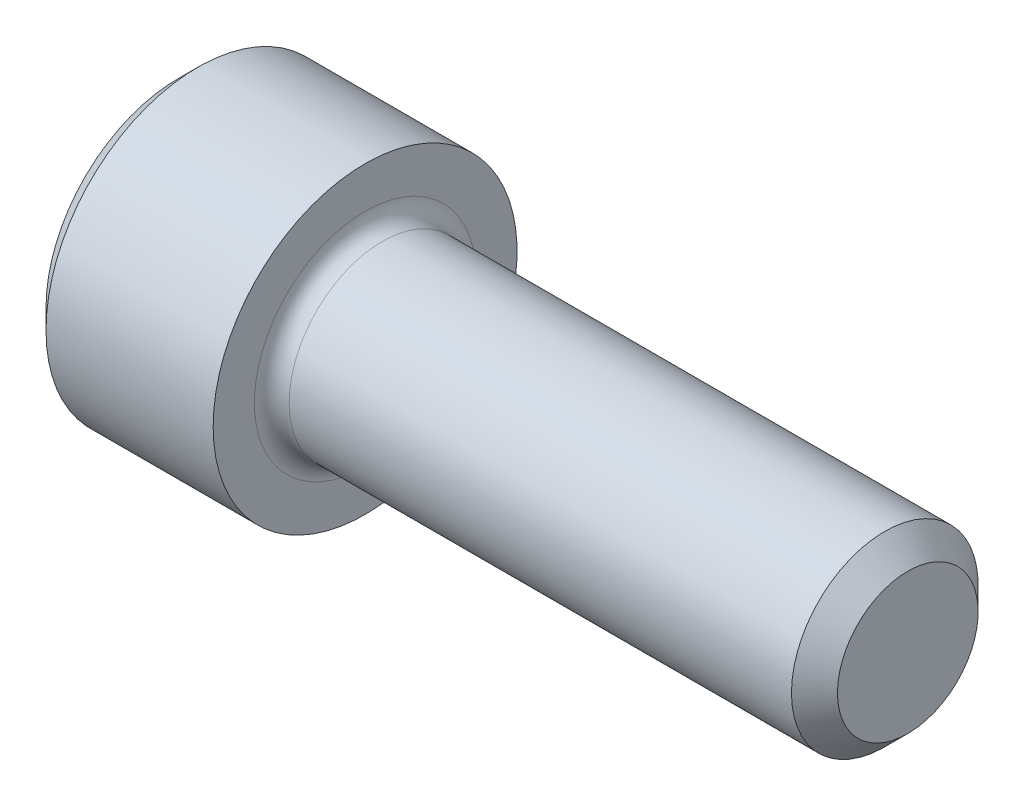
ISO-10303-21;
HEADER;
FILE_DESCRIPTION(('STEP AP214'),'2;1');
FILE_NAME('part.step','',(''),(''),'','','');
FILE_SCHEMA(('AUTOMOTIVE_DESIGN { 1 0 10303 214 1 1 1 1 }'));
ENDSEC;
DATA;
#1=APPLICATION_CONTEXT('core data for automotive mechanical design processes');
#2=APPLICATION_PROTOCOL_DEFINITION('international standard','automotive_design',2000,#1);
#3=PRODUCT_CONTEXT('',#1,'mechanical');
#4=PRODUCT('Part','Part','',(#3));
#5=PRODUCT_RELATED_PRODUCT_CATEGORY('part','',(#4));
#6=PRODUCT_DEFINITION_FORMATION('','',#4);
#7=PRODUCT_DEFINITION_CONTEXT('part definition',#1,'design');
#8=PRODUCT_DEFINITION('design','',#6,#7);
#9=PRODUCT_DEFINITION_SHAPE('','',#8);
#10=(LENGTH_UNIT() NAMED_UNIT(*) SI_UNIT(.MILLI.,.METRE.));
#11=(NAMED_UNIT(*) PLANE_ANGLE_UNIT() SI_UNIT($,.RADIAN.));
#12=(NAMED_UNIT(*) SI_UNIT($,.STERADIAN.) SOLID_ANGLE_UNIT());
#13=UNCERTAINTY_MEASURE_WITH_UNIT(LENGTH_MEASURE(1.E-05),#10,'distance_accuracy_value','');
#14=(GEOMETRIC_REPRESENTATION_CONTEXT(3) GLOBAL_UNCERTAINTY_ASSIGNED_CONTEXT((#13)) GLOBAL_UNIT_ASSIGNED_CONTEXT((#10,
#11,#12)) REPRESENTATION_CONTEXT('',''));
#15=CARTESIAN_POINT('',(0.,0.,0.));
#16=DIRECTION('',(0.,0.,1.));
#17=DIRECTION('',(1.,0.,0.));
#18=AXIS2_PLACEMENT_3D('',#15,#16,#17);
#19=CARTESIAN_POINT('',(0.,0.,0.));
#20=DIRECTION('',(-1.,0.,0.));
#21=DIRECTION('',(0.,0.,1.));
#22=AXIS2_PLACEMENT_3D('',#19,#20,#21);
#23=PLANE('',#22);
#24=DIRECTION('',(0.,-0.499999999999998,0.866025403784439));
#25=VECTOR('',#24,1.);
#26=CARTESIAN_POINT('',(0.,1.14384635331849,0.));
#27=LINE('',#26,#25);
#28=CARTESIAN_POINT('',(0.,1.14384635331849,0.));
#29=VERTEX_POINT('',#28);
#30=CARTESIAN_POINT('',(0.,0.571923176659249,0.990599999999998));
#31=VERTEX_POINT('',#30);
#32=EDGE_CURVE('E260',#29,#31,#27,.T.);
#33=ORIENTED_EDGE('',*,*,#32,.T.);
#34=DIRECTION('',(0.,1.,0.));
#35=VECTOR('',#34,1.);
#36=CARTESIAN_POINT('',(0.,-0.571923176659238,0.9906));
#37=LINE('',#36,#35);
#38=CARTESIAN_POINT('',(0.,-0.571923176659238,0.9906));
#39=VERTEX_POINT('',#38);
#40=EDGE_CURVE('E131',#39,#31,#37,.T.);
#41=ORIENTED_EDGE('',*,*,#40,.F.);
#42=DIRECTION('',(0.,-0.500000000000001,-0.866025403784438));
#43=VECTOR('',#42,1.);
#44=CARTESIAN_POINT('',(0.,-0.571923176659238,0.9906));
#45=LINE('',#44,#43);
#46=CARTESIAN_POINT('',(0.,-1.14384635331848,0.));
#47=VERTEX_POINT('',#46);
#48=EDGE_CURVE('E263',#39,#47,#45,.T.);
#49=ORIENTED_EDGE('',*,*,#48,.T.);
#50=DIRECTION('',(0.,0.499999999999998,-0.86602540378444));
#51=VECTOR('',#50,1.);
#52=CARTESIAN_POINT('',(0.,-1.14384635331848,0.));
#53=LINE('',#52,#51);
#54=CARTESIAN_POINT('',(0.,-0.571923176659241,-0.9906));
#55=VERTEX_POINT('',#54);
#56=EDGE_CURVE('E266',#47,#55,#53,.T.);
#57=ORIENTED_EDGE('',*,*,#56,.T.);
#58=DIRECTION('',(0.,-1.,0.));
#59=VECTOR('',#58,1.);
#60=CARTESIAN_POINT('',(0.,0.571923176659246,-0.990600000000002));
#61=LINE('',#60,#59);
#62=CARTESIAN_POINT('',(0.,0.571923176659246,-0.990600000000002));
#63=VERTEX_POINT('',#62);
#64=EDGE_CURVE('E269',#63,#55,#61,.T.);
#65=ORIENTED_EDGE('',*,*,#64,.F.);
#66=DIRECTION('',(0.,-0.500000000000001,-0.866025403784438));
#67=VECTOR('',#66,1.);
#68=CARTESIAN_POINT('',(0.,1.14384635331849,0.));
#69=LINE('',#68,#67);
#70=EDGE_CURVE('E126',#29,#63,#69,.T.);
#71=ORIENTED_EDGE('',*,*,#70,.F.);
#72=EDGE_LOOP('',(#33,#41,#49,#57,#65,#71));
#73=FACE_BOUND('',#72,.T.);
#74=CARTESIAN_POINT('',(0.,0.,0.));
#75=DIRECTION('',(-1.,0.,0.));
#76=DIRECTION('',(0.,0.,1.));
#77=AXIS2_PLACEMENT_3D('',#74,#75,#76);
#78=CIRCLE('',#77,1.5494);
#79=CARTESIAN_POINT('',(0.,0.,1.5494));
#80=VERTEX_POINT('',#79);
#81=EDGE_CURVE('E155',#80,#80,#78,.T.);
#82=ORIENTED_EDGE('',*,*,#81,.T.);
#83=EDGE_LOOP('',(#82));
#84=FACE_BOUND('',#83,.T.);
#85=ADVANCED_FACE('F35',(#73,#84),#23,.T.);
#86=CARTESIAN_POINT('',(0.,0.,0.));
#87=DIRECTION('',(1.,0.,0.));
#88=DIRECTION('',(0.,0.,-1.));
#89=AXIS2_PLACEMENT_3D('',#86,#87,#88);
#90=CONICAL_SURFACE('',#89,1.5494,0.785398163397442);
#91=CARTESIAN_POINT('',(0.228600000000002,0.,0.));
#92=DIRECTION('',(-1.,0.,0.));
#93=DIRECTION('',(0.,0.,1.));
#94=AXIS2_PLACEMENT_3D('',#91,#92,#93);
#95=CIRCLE('',#94,1.778);
#96=CARTESIAN_POINT('',(0.228600000000002,0.,1.778));
#97=VERTEX_POINT('',#96);
#98=EDGE_CURVE('E152',#97,#97,#95,.T.);
#99=ORIENTED_EDGE('',*,*,#98,.T.);
#100=EDGE_LOOP('',(#99));
#101=FACE_BOUND('',#100,.T.);
#102=ORIENTED_EDGE('',*,*,#81,.F.);
#103=EDGE_LOOP('',(#102));
#104=FACE_BOUND('',#103,.T.);
#105=ADVANCED_FACE('F176',(#101,#104),#90,.T.);
#106=CARTESIAN_POINT('',(-31.75,0.,0.));
#107=DIRECTION('',(-1.,0.,0.));
#108=DIRECTION('',(0.,0.,1.));
#109=AXIS2_PLACEMENT_3D('',#106,#107,#108);
#110=CYLINDRICAL_SURFACE('',#109,1.778);
#111=CARTESIAN_POINT('',(2.1844,0.,0.));
#112=DIRECTION('',(-1.,0.,0.));
#113=DIRECTION('',(0.,0.,1.));
#114=AXIS2_PLACEMENT_3D('',#111,#112,#113);
#115=CIRCLE('',#114,1.778);
#116=CARTESIAN_POINT('',(2.1844,0.,1.778));
#117=VERTEX_POINT('',#116);
#118=EDGE_CURVE('E149',#117,#117,#115,.T.);
#119=ORIENTED_EDGE('',*,*,#118,.T.);
#120=EDGE_LOOP('',(#119));
#121=FACE_BOUND('',#120,.T.);
#122=ORIENTED_EDGE('',*,*,#98,.F.);
#123=EDGE_LOOP('',(#122));
#124=FACE_BOUND('',#123,.T.);
#125=ADVANCED_FACE('F181',(#121,#124),#110,.T.);
#126=CARTESIAN_POINT('',(2.1844,1.778,0.));
#127=DIRECTION('',(1.,0.,0.));
#128=DIRECTION('',(0.,0.,-1.));
#129=AXIS2_PLACEMENT_3D('',#126,#127,#128);
#130=PLANE('',#129);
#131=CARTESIAN_POINT('',(2.1844,0.,0.));
#132=DIRECTION('',(1.,0.,0.));
#133=DIRECTION('',(0.,0.,-1.));
#134=AXIS2_PLACEMENT_3D('',#131,#132,#133);
#135=CIRCLE('',#134,1.29539999999999);
#136=CARTESIAN_POINT('',(2.1844,0.,-1.29539999999999));
#137=VERTEX_POINT('',#136);
#138=EDGE_CURVE('E43',#137,#137,#135,.F.);
#139=ORIENTED_EDGE('',*,*,#138,.T.);
#140=EDGE_LOOP('',(#139));
#141=FACE_BOUND('',#140,.T.);
#142=ORIENTED_EDGE('',*,*,#118,.F.);
#143=EDGE_LOOP('',(#142));
#144=FACE_BOUND('',#143,.T.);
#145=ADVANCED_FACE('F160',(#141,#144),#130,.T.);
#146=CARTESIAN_POINT('',(-31.75,0.,0.));
#147=DIRECTION('',(-1.,0.,0.));
#148=DIRECTION('',(0.,0.,1.));
#149=AXIS2_PLACEMENT_3D('',#146,#147,#148);
#150=CYLINDRICAL_SURFACE('',#149,1.09219999999999);
#151=CARTESIAN_POINT('',(2.3876,0.,0.));
#152=DIRECTION('',(1.,0.,0.));
#153=DIRECTION('',(0.,0.,-1.));
#154=AXIS2_PLACEMENT_3D('',#151,#152,#153);
#155=CIRCLE('',#154,1.09219999999999);
#156=CARTESIAN_POINT('',(2.3876,0.,-1.09219999999999));
#157=VERTEX_POINT('',#156);
#158=EDGE_CURVE('E11',#157,#157,#155,.T.);
#159=ORIENTED_EDGE('',*,*,#158,.T.);
#160=EDGE_LOOP('',(#159));
#161=FACE_BOUND('',#160,.T.);
#162=CARTESIAN_POINT('',(8.26515999999999,0.,0.));
#163=DIRECTION('',(-1.,0.,0.));
#164=DIRECTION('',(0.,0.,1.));
#165=AXIS2_PLACEMENT_3D('',#162,#163,#164);
#166=CIRCLE('',#165,1.09219999999998);
#167=CARTESIAN_POINT('',(8.26515999999999,0.,1.09219999999998));
#168=VERTEX_POINT('',#167);
#169=EDGE_CURVE('E146',#168,#168,#166,.T.);
#170=ORIENTED_EDGE('',*,*,#169,.T.);
#171=EDGE_LOOP('',(#170));
#172=FACE_BOUND('',#171,.T.);
#173=ADVANCED_FACE('F191',(#161,#172),#150,.T.);
#174=CARTESIAN_POINT('',(8.5344,0.,0.));
#175=DIRECTION('',(-1.,0.,0.));
#176=DIRECTION('',(0.,0.,1.));
#177=AXIS2_PLACEMENT_3D('',#174,#175,#176);
#178=CONICAL_SURFACE('',#177,0.82296,0.785398163397413);
#179=ORIENTED_EDGE('',*,*,#169,.F.);
#180=EDGE_LOOP('',(#179));
#181=FACE_BOUND('',#180,.T.);
#182=CARTESIAN_POINT('',(8.5344,0.,0.));
#183=DIRECTION('',(-1.,0.,0.));
#184=DIRECTION('',(0.,0.,1.));
#185=AXIS2_PLACEMENT_3D('',#182,#183,#184);
#186=CIRCLE('',#185,0.82296);
#187=CARTESIAN_POINT('',(8.5344,0.,0.82296));
#188=VERTEX_POINT('',#187);
#189=EDGE_CURVE('E142',#188,#188,#186,.T.);
#190=ORIENTED_EDGE('',*,*,#189,.T.);
#191=EDGE_LOOP('',(#190));
#192=FACE_BOUND('',#191,.T.);
#193=ADVANCED_FACE('F171',(#181,#192),#178,.T.);
#194=CARTESIAN_POINT('',(8.5344,0.82296,0.));
#195=DIRECTION('',(1.,0.,0.));
#196=DIRECTION('',(0.,0.,-1.));
#197=AXIS2_PLACEMENT_3D('',#194,#195,#196);
#198=PLANE('',#197);
#199=ORIENTED_EDGE('',*,*,#189,.F.);
#200=EDGE_LOOP('',(#199));
#201=FACE_BOUND('',#200,.T.);
#202=ADVANCED_FACE('F164',(#201),#198,.T.);
#203=CARTESIAN_POINT('',(2.3876,0.,0.));
#204=DIRECTION('',(1.,0.,0.));
#205=DIRECTION('',(0.,0.,-1.));
#206=AXIS2_PLACEMENT_3D('',#203,#204,#205);
#207=TOROIDAL_SURFACE('',#206,1.29539999999999,0.2032);
#208=ORIENTED_EDGE('',*,*,#158,.F.);
#209=EDGE_LOOP('',(#208));
#210=FACE_BOUND('',#209,.T.);
#211=ORIENTED_EDGE('',*,*,#138,.F.);
#212=EDGE_LOOP('',(#211));
#213=FACE_BOUND('',#212,.T.);
#214=ADVANCED_FACE('F37',(#210,#213),#207,.F.);
#215=CARTESIAN_POINT('',(0.9652,1.14384635331849,0.));
#216=DIRECTION('',(0.,-0.866025403784439,-0.499999999999998));
#217=DIRECTION('',(0.,0.499999999999999,-0.86602540378444));
#218=AXIS2_PLACEMENT_3D('',#215,#216,#217);
#219=PLANE('',#218);
#220=ORIENTED_EDGE('',*,*,#32,.F.);
#221=DIRECTION('',(-1.,0.,0.));
#222=VECTOR('',#221,1.);
#223=CARTESIAN_POINT('',(0.9652,1.14384635331849,0.));
#224=LINE('',#223,#222);
#225=CARTESIAN_POINT('',(0.9652,1.14384635331849,0.));
#226=VERTEX_POINT('',#225);
#227=EDGE_CURVE('E250',#226,#29,#224,.T.);
#228=ORIENTED_EDGE('',*,*,#227,.F.);
#229=DIRECTION('',(0.,-0.499999999999998,0.866025403784439));
#230=VECTOR('',#229,1.);
#231=CARTESIAN_POINT('',(0.9652,1.14384635331849,0.));
#232=LINE('',#231,#230);
#233=CARTESIAN_POINT('',(0.9652,0.857884764988868,0.4953));
#234=VERTEX_POINT('',#233);
#235=EDGE_CURVE('E118',#226,#234,#232,.T.);
#236=ORIENTED_EDGE('',*,*,#235,.T.);
#237=CARTESIAN_POINT('',(0.9652,0.571923176659249,0.990599999999998));
#238=VERTEX_POINT('',#237);
#239=EDGE_CURVE('E109',#234,#238,#232,.T.);
#240=ORIENTED_EDGE('',*,*,#239,.T.);
#241=DIRECTION('',(-1.,0.,0.));
#242=VECTOR('',#241,1.);
#243=CARTESIAN_POINT('',(0.9652,0.571923176659249,0.990599999999998));
#244=LINE('',#243,#242);
#245=EDGE_CURVE('E123',#238,#31,#244,.T.);
#246=ORIENTED_EDGE('',*,*,#245,.T.);
#247=EDGE_LOOP('',(#220,#228,#236,#240,#246));
#248=FACE_BOUND('',#247,.T.);
#249=ADVANCED_FACE('F122',(#248),#219,.T.);
#250=CARTESIAN_POINT('',(0.9652,-0.571923176659238,0.9906));
#251=DIRECTION('',(0.,0.,1.));
#252=DIRECTION('',(0.,-1.,0.));
#253=AXIS2_PLACEMENT_3D('',#250,#251,#252);
#254=PLANE('',#253);
#255=ORIENTED_EDGE('',*,*,#40,.T.);
#256=ORIENTED_EDGE('',*,*,#245,.F.);
#257=DIRECTION('',(0.,1.,0.));
#258=VECTOR('',#257,1.);
#259=CARTESIAN_POINT('',(0.9652,-0.571923176659238,0.9906));
#260=LINE('',#259,#258);
#261=CARTESIAN_POINT('',(0.9652,0.,0.990599999999999));
#262=VERTEX_POINT('',#261);
#263=EDGE_CURVE('E106',#262,#238,#260,.T.);
#264=ORIENTED_EDGE('',*,*,#263,.F.);
#265=CARTESIAN_POINT('',(0.9652,-0.571923176659238,0.9906));
#266=VERTEX_POINT('',#265);
#267=EDGE_CURVE('E117',#266,#262,#260,.T.);
#268=ORIENTED_EDGE('',*,*,#267,.F.);
#269=DIRECTION('',(-1.,0.,0.));
#270=VECTOR('',#269,1.);
#271=CARTESIAN_POINT('',(0.9652,-0.571923176659238,0.9906));
#272=LINE('',#271,#270);
#273=EDGE_CURVE('E133',#266,#39,#272,.T.);
#274=ORIENTED_EDGE('',*,*,#273,.T.);
#275=EDGE_LOOP('',(#255,#256,#264,#268,#274));
#276=FACE_BOUND('',#275,.T.);
#277=ADVANCED_FACE('F128',(#276),#254,.F.);
#278=CARTESIAN_POINT('',(0.9652,-0.571923176659238,0.9906));
#279=DIRECTION('',(0.,0.866025403784438,-0.500000000000001));
#280=DIRECTION('',(0.,0.500000000000001,0.866025403784438));
#281=AXIS2_PLACEMENT_3D('',#278,#279,#280);
#282=PLANE('',#281);
#283=ORIENTED_EDGE('',*,*,#48,.F.);
#284=ORIENTED_EDGE('',*,*,#273,.F.);
#285=DIRECTION('',(0.,-0.500000000000001,-0.866025403784438));
#286=VECTOR('',#285,1.);
#287=CARTESIAN_POINT('',(0.9652,-0.571923176659238,0.9906));
#288=LINE('',#287,#286);
#289=CARTESIAN_POINT('',(0.9652,-0.85788476498886,0.495299999999999));
#290=VERTEX_POINT('',#289);
#291=EDGE_CURVE('E289',#266,#290,#288,.T.);
#292=ORIENTED_EDGE('',*,*,#291,.T.);
#293=CARTESIAN_POINT('',(0.9652,-1.14384635331848,0.));
#294=VERTEX_POINT('',#293);
#295=EDGE_CURVE('E278',#290,#294,#288,.T.);
#296=ORIENTED_EDGE('',*,*,#295,.T.);
#297=DIRECTION('',(-1.,0.,0.));
#298=VECTOR('',#297,1.);
#299=CARTESIAN_POINT('',(0.9652,-1.14384635331848,0.));
#300=LINE('',#299,#298);
#301=EDGE_CURVE('E138',#294,#47,#300,.T.);
#302=ORIENTED_EDGE('',*,*,#301,.T.);
#303=EDGE_LOOP('',(#283,#284,#292,#296,#302));
#304=FACE_BOUND('',#303,.T.);
#305=ADVANCED_FACE('F204',(#304),#282,.T.);
#306=CARTESIAN_POINT('',(0.9652,-1.14384635331848,0.));
#307=DIRECTION('',(0.,0.86602540378444,0.499999999999998));
#308=DIRECTION('',(0.,-0.499999999999998,0.86602540378444));
#309=AXIS2_PLACEMENT_3D('',#306,#307,#308);
#310=PLANE('',#309);
#311=ORIENTED_EDGE('',*,*,#56,.F.);
#312=ORIENTED_EDGE('',*,*,#301,.F.);
#313=DIRECTION('',(0.,0.499999999999998,-0.86602540378444));
#314=VECTOR('',#313,1.);
#315=CARTESIAN_POINT('',(0.9652,-1.14384635331848,0.));
#316=LINE('',#315,#314);
#317=CARTESIAN_POINT('',(0.9652,-0.857884764988863,-0.495299999999997));
#318=VERTEX_POINT('',#317);
#319=EDGE_CURVE('E256',#294,#318,#316,.T.);
#320=ORIENTED_EDGE('',*,*,#319,.T.);
#321=CARTESIAN_POINT('',(0.9652,-0.571923176659241,-0.9906));
#322=VERTEX_POINT('',#321);
#323=EDGE_CURVE('E288',#318,#322,#316,.T.);
#324=ORIENTED_EDGE('',*,*,#323,.T.);
#325=DIRECTION('',(-1.,0.,0.));
#326=VECTOR('',#325,1.);
#327=CARTESIAN_POINT('',(0.9652,-0.571923176659241,-0.9906));
#328=LINE('',#327,#326);
#329=EDGE_CURVE('E249',#322,#55,#328,.T.);
#330=ORIENTED_EDGE('',*,*,#329,.T.);
#331=EDGE_LOOP('',(#311,#312,#320,#324,#330));
#332=FACE_BOUND('',#331,.T.);
#333=ADVANCED_FACE('F207',(#332),#310,.T.);
#334=CARTESIAN_POINT('',(0.9652,0.571923176659246,-0.990600000000002));
#335=DIRECTION('',(0.,0.,-1.));
#336=DIRECTION('',(0.,1.,0.));
#337=AXIS2_PLACEMENT_3D('',#334,#335,#336);
#338=PLANE('',#337);
#339=ORIENTED_EDGE('',*,*,#64,.T.);
#340=ORIENTED_EDGE('',*,*,#329,.F.);
#341=DIRECTION('',(0.,-1.,0.));
#342=VECTOR('',#341,1.);
#343=CARTESIAN_POINT('',(0.9652,0.571923176659246,-0.990600000000002));
#344=LINE('',#343,#342);
#345=CARTESIAN_POINT('',(0.965200000000003,0.,-0.990599999999999));
#346=VERTEX_POINT('',#345);
#347=EDGE_CURVE('E253',#346,#322,#344,.T.);
#348=ORIENTED_EDGE('',*,*,#347,.F.);
#349=CARTESIAN_POINT('',(0.9652,0.571923176659246,-0.990600000000002));
#350=VERTEX_POINT('',#349);
#351=EDGE_CURVE('E50',#350,#346,#344,.T.);
#352=ORIENTED_EDGE('',*,*,#351,.F.);
#353=DIRECTION('',(-1.,0.,0.));
#354=VECTOR('',#353,1.);
#355=CARTESIAN_POINT('',(0.9652,0.571923176659246,-0.990600000000002));
#356=LINE('',#355,#354);
#357=EDGE_CURVE('E246',#350,#63,#356,.T.);
#358=ORIENTED_EDGE('',*,*,#357,.T.);
#359=EDGE_LOOP('',(#339,#340,#348,#352,#358));
#360=FACE_BOUND('',#359,.T.);
#361=ADVANCED_FACE('F211',(#360),#338,.F.);
#362=CARTESIAN_POINT('',(0.9652,1.14384635331849,0.));
#363=DIRECTION('',(0.,0.866025403784438,-0.500000000000001));
#364=DIRECTION('',(0.,0.500000000000001,0.866025403784438));
#365=AXIS2_PLACEMENT_3D('',#362,#363,#364);
#366=PLANE('',#365);
#367=ORIENTED_EDGE('',*,*,#70,.T.);
#368=ORIENTED_EDGE('',*,*,#357,.F.);
#369=DIRECTION('',(0.,-0.500000000000001,-0.866025403784438));
#370=VECTOR('',#369,1.);
#371=CARTESIAN_POINT('',(0.9652,1.14384635331849,0.));
#372=LINE('',#371,#370);
#373=CARTESIAN_POINT('',(0.9652,0.857884764988868,-0.495300000000003));
#374=VERTEX_POINT('',#373);
#375=EDGE_CURVE('E236',#374,#350,#372,.T.);
#376=ORIENTED_EDGE('',*,*,#375,.F.);
#377=EDGE_CURVE('E242',#226,#374,#372,.T.);
#378=ORIENTED_EDGE('',*,*,#377,.F.);
#379=ORIENTED_EDGE('',*,*,#227,.T.);
#380=EDGE_LOOP('',(#367,#368,#376,#378,#379));
#381=FACE_BOUND('',#380,.T.);
#382=ADVANCED_FACE('F215',(#381),#366,.F.);
#383=CARTESIAN_POINT('',(0.9652,1.71576952997773,-0.990600000000003));
#384=DIRECTION('',(1.,0.,0.));
#385=DIRECTION('',(0.,0.,-1.));
#386=AXIS2_PLACEMENT_3D('',#383,#384,#385);
#387=PLANE('',#386);
#388=ORIENTED_EDGE('',*,*,#347,.T.);
#389=ORIENTED_EDGE('',*,*,#323,.F.);
#390=CARTESIAN_POINT('',(0.965200000000003,0.,0.));
#391=DIRECTION('',(-1.,0.,0.));
#392=DIRECTION('',(0.,0.,1.));
#393=AXIS2_PLACEMENT_3D('',#390,#391,#392);
#394=CIRCLE('',#393,0.990599999999999);
#395=EDGE_CURVE('E284',#346,#318,#394,.T.);
#396=ORIENTED_EDGE('',*,*,#395,.F.);
#397=EDGE_LOOP('',(#388,#389,#396));
#398=FACE_BOUND('',#397,.T.);
#399=ADVANCED_FACE('F219',(#398),#387,.F.);
#400=ORIENTED_EDGE('',*,*,#319,.F.);
#401=ORIENTED_EDGE('',*,*,#295,.F.);
#402=EDGE_CURVE('E136',#318,#290,#394,.T.);
#403=ORIENTED_EDGE('',*,*,#402,.F.);
#404=EDGE_LOOP('',(#400,#401,#403));
#405=FACE_BOUND('',#404,.T.);
#406=ADVANCED_FACE('F222',(#405),#387,.F.);
#407=ORIENTED_EDGE('',*,*,#291,.F.);
#408=ORIENTED_EDGE('',*,*,#267,.T.);
#409=EDGE_CURVE('E132',#290,#262,#394,.T.);
#410=ORIENTED_EDGE('',*,*,#409,.F.);
#411=EDGE_LOOP('',(#407,#408,#410));
#412=FACE_BOUND('',#411,.T.);
#413=ADVANCED_FACE('F227',(#412),#387,.F.);
#414=ORIENTED_EDGE('',*,*,#263,.T.);
#415=ORIENTED_EDGE('',*,*,#239,.F.);
#416=EDGE_CURVE('E112',#262,#234,#394,.T.);
#417=ORIENTED_EDGE('',*,*,#416,.F.);
#418=EDGE_LOOP('',(#414,#415,#417));
#419=FACE_BOUND('',#418,.T.);
#420=ADVANCED_FACE('F108',(#419),#387,.F.);
#421=ORIENTED_EDGE('',*,*,#235,.F.);
#422=ORIENTED_EDGE('',*,*,#377,.T.);
#423=EDGE_CURVE('E143',#234,#374,#394,.T.);
#424=ORIENTED_EDGE('',*,*,#423,.F.);
#425=EDGE_LOOP('',(#421,#422,#424));
#426=FACE_BOUND('',#425,.T.);
#427=ADVANCED_FACE('F230',(#426),#387,.F.);
#428=ORIENTED_EDGE('',*,*,#375,.T.);
#429=ORIENTED_EDGE('',*,*,#351,.T.);
#430=EDGE_CURVE('E239',#374,#346,#394,.T.);
#431=ORIENTED_EDGE('',*,*,#430,.F.);
#432=EDGE_LOOP('',(#428,#429,#431));
#433=FACE_BOUND('',#432,.T.);
#434=ADVANCED_FACE('F200',(#433),#387,.F.);
#435=CARTESIAN_POINT('',(0.965200000000003,0.,0.));
#436=DIRECTION('',(-1.,0.,0.));
#437=DIRECTION('',(0.,0.,1.));
#438=AXIS2_PLACEMENT_3D('',#435,#436,#437);
#439=CONICAL_SURFACE('',#438,0.990599999999999,1.04719755119659);
#440=CARTESIAN_POINT('',(1.53712317665926,0.,0.));
#441=VERTEX_POINT('',#440);
#442=VERTEX_LOOP('',#441);
#443=FACE_BOUND('',#442,.T.);
#444=ORIENTED_EDGE('',*,*,#416,.T.);
#445=ORIENTED_EDGE('',*,*,#423,.T.);
#446=ORIENTED_EDGE('',*,*,#430,.T.);
#447=ORIENTED_EDGE('',*,*,#395,.T.);
#448=ORIENTED_EDGE('',*,*,#402,.T.);
#449=ORIENTED_EDGE('',*,*,#409,.T.);
#450=EDGE_LOOP('',(#444,#445,#446,#447,#448,#449));
#451=FACE_BOUND('',#450,.T.);
#452=ADVANCED_FACE('F198',(#443,#451),#439,.F.);
#453=CLOSED_SHELL('',(#85,#105,#125,#145,#173,#193,#202,#214,#249,#277,#305,#333,#361,#382,#399,
#406,#413,#420,#427,#434,#452));
#454=MANIFOLD_SOLID_BREP('B2',#453);
#455=ADVANCED_BREP_SHAPE_REPRESENTATION('',(#18,#454),#14);
#456=SHAPE_DEFINITION_REPRESENTATION(#9,#455);
ENDSEC;
END-ISO-10303-21;
